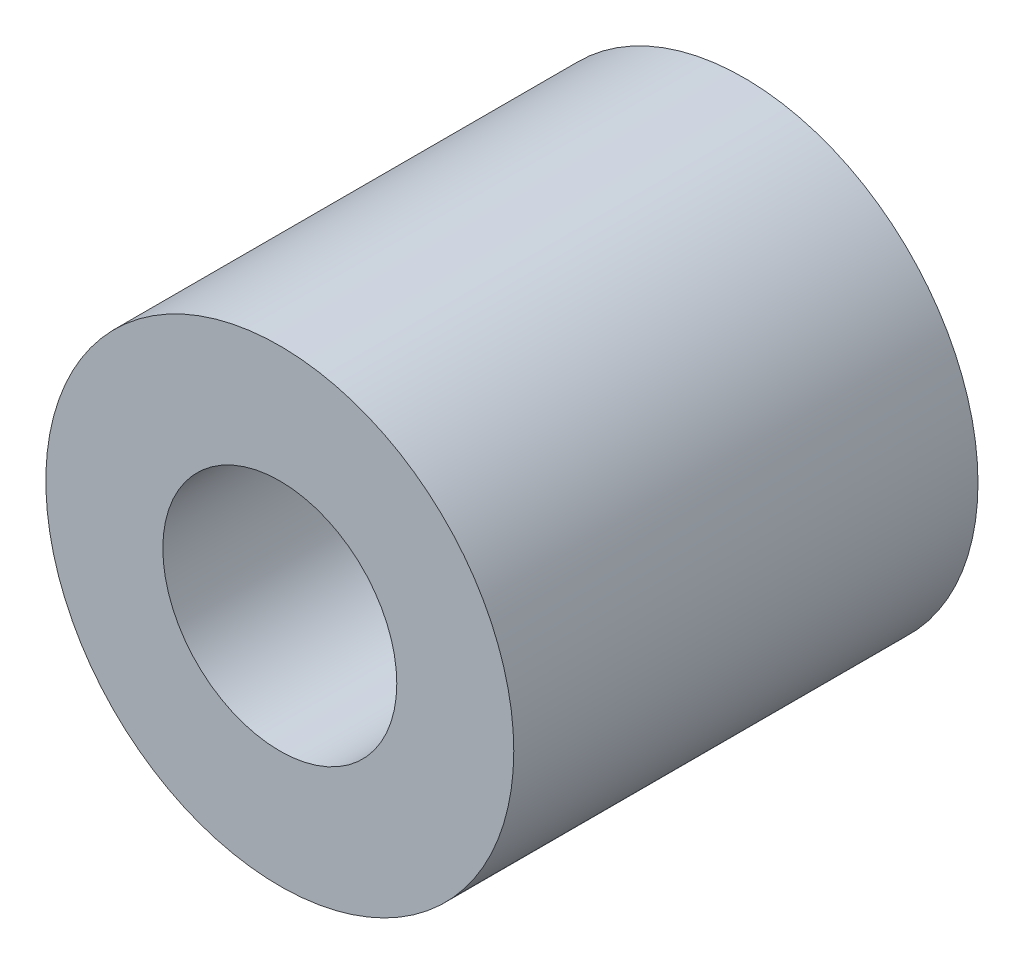
ISO-10303-21;
HEADER;
FILE_DESCRIPTION(('STEP AP214'),'2;1');
FILE_NAME('part.step','',(''),(''),'','','');
FILE_SCHEMA(('AUTOMOTIVE_DESIGN { 1 0 10303 214 1 1 1 1 }'));
ENDSEC;
DATA;
#1=APPLICATION_CONTEXT('core data for automotive mechanical design processes');
#2=APPLICATION_PROTOCOL_DEFINITION('international standard','automotive_design',2000,#1);
#3=PRODUCT_CONTEXT('',#1,'mechanical');
#4=PRODUCT('Part','Part','',(#3));
#5=PRODUCT_RELATED_PRODUCT_CATEGORY('part','',(#4));
#6=PRODUCT_DEFINITION_FORMATION('','',#4);
#7=PRODUCT_DEFINITION_CONTEXT('part definition',#1,'design');
#8=PRODUCT_DEFINITION('design','',#6,#7);
#9=PRODUCT_DEFINITION_SHAPE('','',#8);
#10=(LENGTH_UNIT() NAMED_UNIT(*) SI_UNIT(.MILLI.,.METRE.));
#11=(NAMED_UNIT(*) PLANE_ANGLE_UNIT() SI_UNIT($,.RADIAN.));
#12=(NAMED_UNIT(*) SI_UNIT($,.STERADIAN.) SOLID_ANGLE_UNIT());
#13=UNCERTAINTY_MEASURE_WITH_UNIT(LENGTH_MEASURE(1.E-05),#10,'distance_accuracy_value','');
#14=(GEOMETRIC_REPRESENTATION_CONTEXT(3) GLOBAL_UNCERTAINTY_ASSIGNED_CONTEXT((#13)) GLOBAL_UNIT_ASSIGNED_CONTEXT((#10,
#11,#12)) REPRESENTATION_CONTEXT('',''));
#15=CARTESIAN_POINT('',(0.,0.,0.));
#16=DIRECTION('',(0.,0.,1.));
#17=DIRECTION('',(1.,0.,0.));
#18=AXIS2_PLACEMENT_3D('',#15,#16,#17);
#19=CARTESIAN_POINT('',(0.,0.,3.175));
#20=DIRECTION('',(0.,0.,1.));
#21=DIRECTION('',(1.,0.,0.));
#22=AXIS2_PLACEMENT_3D('',#19,#20,#21);
#23=PLANE('',#22);
#24=CARTESIAN_POINT('',(0.,0.,3.175));
#25=DIRECTION('',(0.,0.,1.));
#26=DIRECTION('',(1.,0.,0.));
#27=AXIS2_PLACEMENT_3D('',#24,#25,#26);
#28=CIRCLE('',#27,3.2004);
#29=CARTESIAN_POINT('',(3.2004,0.,3.175));
#30=VERTEX_POINT('',#29);
#31=EDGE_CURVE('E10',#30,#30,#28,.T.);
#32=ORIENTED_EDGE('',*,*,#31,.T.);
#33=EDGE_LOOP('',(#32));
#34=FACE_BOUND('',#33,.T.);
#35=CARTESIAN_POINT('',(0.,0.,3.175));
#36=DIRECTION('',(0.,0.,1.));
#37=DIRECTION('',(1.,0.,0.));
#38=AXIS2_PLACEMENT_3D('',#35,#36,#37);
#39=CIRCLE('',#38,1.6002);
#40=CARTESIAN_POINT('',(1.6002,0.,3.175));
#41=VERTEX_POINT('',#40);
#42=EDGE_CURVE('E52',#41,#41,#39,.T.);
#43=ORIENTED_EDGE('',*,*,#42,.F.);
#44=EDGE_LOOP('',(#43));
#45=FACE_BOUND('',#44,.T.);
#46=ADVANCED_FACE('F44',(#34,#45),#23,.T.);
#47=CARTESIAN_POINT('',(0.,0.,3.175));
#48=DIRECTION('',(0.,0.,-1.));
#49=DIRECTION('',(-1.,0.,0.));
#50=AXIS2_PLACEMENT_3D('',#47,#48,#49);
#51=CYLINDRICAL_SURFACE('',#50,3.2004);
#52=ORIENTED_EDGE('',*,*,#31,.F.);
#53=EDGE_LOOP('',(#52));
#54=FACE_BOUND('',#53,.T.);
#55=CARTESIAN_POINT('',(0.,0.,-3.175));
#56=DIRECTION('',(0.,0.,1.));
#57=DIRECTION('',(1.,0.,0.));
#58=AXIS2_PLACEMENT_3D('',#55,#56,#57);
#59=CIRCLE('',#58,3.2004);
#60=CARTESIAN_POINT('',(3.2004,0.,-3.175));
#61=VERTEX_POINT('',#60);
#62=EDGE_CURVE('E56',#61,#61,#59,.T.);
#63=ORIENTED_EDGE('',*,*,#62,.T.);
#64=EDGE_LOOP('',(#63));
#65=FACE_BOUND('',#64,.T.);
#66=ADVANCED_FACE('F50',(#54,#65),#51,.T.);
#67=CARTESIAN_POINT('',(0.,0.,3.175));
#68=DIRECTION('',(0.,0.,-1.));
#69=DIRECTION('',(-1.,0.,0.));
#70=AXIS2_PLACEMENT_3D('',#67,#68,#69);
#71=CYLINDRICAL_SURFACE('',#70,1.6002);
#72=ORIENTED_EDGE('',*,*,#42,.T.);
#73=EDGE_LOOP('',(#72));
#74=FACE_BOUND('',#73,.T.);
#75=CARTESIAN_POINT('',(0.,0.,-3.175));
#76=DIRECTION('',(0.,0.,1.));
#77=DIRECTION('',(1.,0.,0.));
#78=AXIS2_PLACEMENT_3D('',#75,#76,#77);
#79=CIRCLE('',#78,1.6002);
#80=CARTESIAN_POINT('',(1.6002,0.,-3.175));
#81=VERTEX_POINT('',#80);
#82=EDGE_CURVE('E63',#81,#81,#79,.T.);
#83=ORIENTED_EDGE('',*,*,#82,.F.);
#84=EDGE_LOOP('',(#83));
#85=FACE_BOUND('',#84,.T.);
#86=ADVANCED_FACE('F77',(#74,#85),#71,.F.);
#87=CARTESIAN_POINT('',(0.,0.,-3.175));
#88=DIRECTION('',(0.,0.,1.));
#89=DIRECTION('',(1.,0.,0.));
#90=AXIS2_PLACEMENT_3D('',#87,#88,#89);
#91=PLANE('',#90);
#92=ORIENTED_EDGE('',*,*,#82,.T.);
#93=EDGE_LOOP('',(#92));
#94=FACE_BOUND('',#93,.T.);
#95=ORIENTED_EDGE('',*,*,#62,.F.);
#96=EDGE_LOOP('',(#95));
#97=FACE_BOUND('',#96,.T.);
#98=ADVANCED_FACE('F71',(#94,#97),#91,.F.);
#99=CLOSED_SHELL('',(#46,#66,#86,#98));
#100=MANIFOLD_SOLID_BREP('B2',#99);
#101=ADVANCED_BREP_SHAPE_REPRESENTATION('',(#18,#100),#14);
#102=SHAPE_DEFINITION_REPRESENTATION(#9,#101);
ENDSEC;
END-ISO-10303-21;
